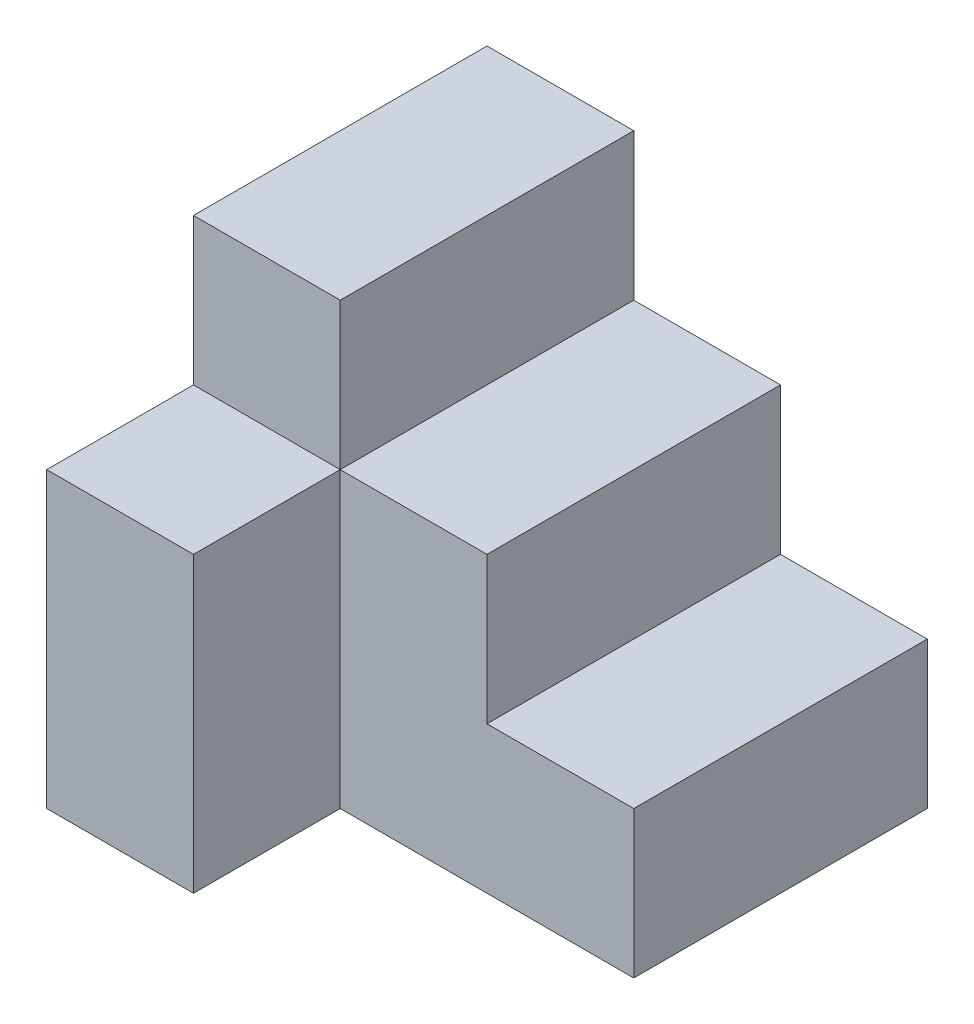
ISO-10303-21;
HEADER;
FILE_DESCRIPTION(('STEP AP214'),'2;1');
FILE_NAME('part.step','',(''),(''),'','','');
FILE_SCHEMA(('AUTOMOTIVE_DESIGN { 1 0 10303 214 1 1 1 1 }'));
ENDSEC;
DATA;
#1=APPLICATION_CONTEXT('core data for automotive mechanical design processes');
#2=APPLICATION_PROTOCOL_DEFINITION('international standard','automotive_design',2000,#1);
#3=PRODUCT_CONTEXT('',#1,'mechanical');
#4=PRODUCT('Part','Part','',(#3));
#5=PRODUCT_RELATED_PRODUCT_CATEGORY('part','',(#4));
#6=PRODUCT_DEFINITION_FORMATION('','',#4);
#7=PRODUCT_DEFINITION_CONTEXT('part definition',#1,'design');
#8=PRODUCT_DEFINITION('design','',#6,#7);
#9=PRODUCT_DEFINITION_SHAPE('','',#8);
#10=(LENGTH_UNIT() NAMED_UNIT(*) SI_UNIT(.MILLI.,.METRE.));
#11=(NAMED_UNIT(*) PLANE_ANGLE_UNIT() SI_UNIT($,.RADIAN.));
#12=(NAMED_UNIT(*) SI_UNIT($,.STERADIAN.) SOLID_ANGLE_UNIT());
#13=UNCERTAINTY_MEASURE_WITH_UNIT(LENGTH_MEASURE(1.E-05),#10,'distance_accuracy_value','');
#14=(GEOMETRIC_REPRESENTATION_CONTEXT(3) GLOBAL_UNCERTAINTY_ASSIGNED_CONTEXT((#13)) GLOBAL_UNIT_ASSIGNED_CONTEXT((#10,
#11,#12)) REPRESENTATION_CONTEXT('',''));
#15=CARTESIAN_POINT('',(0.,0.,0.));
#16=DIRECTION('',(0.,0.,1.));
#17=DIRECTION('',(1.,0.,0.));
#18=AXIS2_PLACEMENT_3D('',#15,#16,#17);
#19=CARTESIAN_POINT('',(0.,0.,-30.));
#20=DIRECTION('',(-1.,0.,0.));
#21=DIRECTION('',(0.,0.,1.));
#22=AXIS2_PLACEMENT_3D('',#19,#20,#21);
#23=PLANE('',#22);
#24=DIRECTION('',(0.,-1.,0.));
#25=VECTOR('',#24,1.);
#26=CARTESIAN_POINT('',(0.,0.,0.));
#27=LINE('',#26,#25);
#28=CARTESIAN_POINT('',(0.,20.,0.));
#29=VERTEX_POINT('',#28);
#30=CARTESIAN_POINT('',(0.,0.,0.));
#31=VERTEX_POINT('',#30);
#32=EDGE_CURVE('E69',#29,#31,#27,.T.);
#33=ORIENTED_EDGE('',*,*,#32,.F.);
#34=DIRECTION('',(0.,0.,1.));
#35=VECTOR('',#34,1.);
#36=CARTESIAN_POINT('',(0.,20.,0.));
#37=LINE('',#36,#35);
#38=CARTESIAN_POINT('',(0.,20.,-10.));
#39=VERTEX_POINT('',#38);
#40=EDGE_CURVE('E133',#39,#29,#37,.T.);
#41=ORIENTED_EDGE('',*,*,#40,.F.);
#42=DIRECTION('',(0.,-1.,0.));
#43=VECTOR('',#42,1.);
#44=CARTESIAN_POINT('',(0.,0.,-10.));
#45=LINE('',#44,#43);
#46=CARTESIAN_POINT('',(0.,30.,-10.));
#47=VERTEX_POINT('',#46);
#48=EDGE_CURVE('E124',#47,#39,#45,.T.);
#49=ORIENTED_EDGE('',*,*,#48,.F.);
#50=DIRECTION('',(0.,0.,1.));
#51=VECTOR('',#50,1.);
#52=CARTESIAN_POINT('',(0.,30.,-30.));
#53=LINE('',#52,#51);
#54=CARTESIAN_POINT('',(0.,30.,-30.));
#55=VERTEX_POINT('',#54);
#56=EDGE_CURVE('E203',#55,#47,#53,.T.);
#57=ORIENTED_EDGE('',*,*,#56,.F.);
#58=DIRECTION('',(0.,-1.,0.));
#59=VECTOR('',#58,1.);
#60=CARTESIAN_POINT('',(0.,0.,-30.));
#61=LINE('',#60,#59);
#62=CARTESIAN_POINT('',(0.,0.,-30.));
#63=VERTEX_POINT('',#62);
#64=EDGE_CURVE('E189',#55,#63,#61,.T.);
#65=ORIENTED_EDGE('',*,*,#64,.T.);
#66=DIRECTION('',(0.,0.,1.));
#67=VECTOR('',#66,1.);
#68=CARTESIAN_POINT('',(0.,0.,-30.));
#69=LINE('',#68,#67);
#70=EDGE_CURVE('E200',#63,#31,#69,.T.);
#71=ORIENTED_EDGE('',*,*,#70,.T.);
#72=EDGE_LOOP('',(#33,#41,#49,#57,#65,#71));
#73=FACE_BOUND('',#72,.T.);
#74=ADVANCED_FACE('F33',(#73),#23,.T.);
#75=CARTESIAN_POINT('',(0.,30.,-30.));
#76=DIRECTION('',(0.,1.,0.));
#77=DIRECTION('',(0.,0.,1.));
#78=AXIS2_PLACEMENT_3D('',#75,#76,#77);
#79=PLANE('',#78);
#80=ORIENTED_EDGE('',*,*,#56,.T.);
#81=DIRECTION('',(1.,0.,0.));
#82=VECTOR('',#81,1.);
#83=CARTESIAN_POINT('',(0.,30.,-10.));
#84=LINE('',#83,#82);
#85=CARTESIAN_POINT('',(10.,30.,-10.));
#86=VERTEX_POINT('',#85);
#87=EDGE_CURVE('E130',#47,#86,#84,.T.);
#88=ORIENTED_EDGE('',*,*,#87,.T.);
#89=DIRECTION('',(0.,0.,1.));
#90=VECTOR('',#89,1.);
#91=CARTESIAN_POINT('',(10.,30.,-30.));
#92=LINE('',#91,#90);
#93=CARTESIAN_POINT('',(10.,30.,-30.));
#94=VERTEX_POINT('',#93);
#95=EDGE_CURVE('E181',#94,#86,#92,.T.);
#96=ORIENTED_EDGE('',*,*,#95,.F.);
#97=DIRECTION('',(-1.,0.,0.));
#98=VECTOR('',#97,1.);
#99=CARTESIAN_POINT('',(0.,30.,-30.));
#100=LINE('',#99,#98);
#101=EDGE_CURVE('E56',#94,#55,#100,.T.);
#102=ORIENTED_EDGE('',*,*,#101,.T.);
#103=EDGE_LOOP('',(#80,#88,#96,#102));
#104=FACE_BOUND('',#103,.T.);
#105=ADVANCED_FACE('F223',(#104),#79,.T.);
#106=CARTESIAN_POINT('',(0.,0.,0.));
#107=DIRECTION('',(0.,0.,-1.));
#108=DIRECTION('',(-1.,0.,0.));
#109=AXIS2_PLACEMENT_3D('',#106,#107,#108);
#110=PLANE('',#109);
#111=DIRECTION('',(1.,0.,0.));
#112=VECTOR('',#111,1.);
#113=CARTESIAN_POINT('',(0.,20.,0.));
#114=LINE('',#113,#112);
#115=CARTESIAN_POINT('',(10.,20.,0.));
#116=VERTEX_POINT('',#115);
#117=EDGE_CURVE('E143',#29,#116,#114,.T.);
#118=ORIENTED_EDGE('',*,*,#117,.F.);
#119=ORIENTED_EDGE('',*,*,#32,.T.);
#120=DIRECTION('',(1.,0.,0.));
#121=VECTOR('',#120,1.);
#122=CARTESIAN_POINT('',(0.,0.,0.));
#123=LINE('',#122,#121);
#124=CARTESIAN_POINT('',(10.,0.,0.));
#125=VERTEX_POINT('',#124);
#126=EDGE_CURVE('E193',#31,#125,#123,.T.);
#127=ORIENTED_EDGE('',*,*,#126,.T.);
#128=DIRECTION('',(0.,-1.,0.));
#129=VECTOR('',#128,1.);
#130=CARTESIAN_POINT('',(10.,0.,0.));
#131=LINE('',#130,#129);
#132=EDGE_CURVE('E162',#116,#125,#131,.T.);
#133=ORIENTED_EDGE('',*,*,#132,.F.);
#134=EDGE_LOOP('',(#118,#119,#127,#133));
#135=FACE_BOUND('',#134,.T.);
#136=ADVANCED_FACE('F225',(#135),#110,.F.);
#137=CARTESIAN_POINT('',(10.,0.,-30.));
#138=DIRECTION('',(-1.,0.,0.));
#139=DIRECTION('',(0.,-1.,0.));
#140=AXIS2_PLACEMENT_3D('',#137,#138,#139);
#141=PLANE('',#140);
#142=DIRECTION('',(0.,0.,-1.));
#143=VECTOR('',#142,1.);
#144=CARTESIAN_POINT('',(10.,20.,-30.));
#145=LINE('',#144,#143);
#146=CARTESIAN_POINT('',(10.,20.,-10.));
#147=VERTEX_POINT('',#146);
#148=EDGE_CURVE('E138',#116,#147,#145,.T.);
#149=ORIENTED_EDGE('',*,*,#148,.F.);
#150=ORIENTED_EDGE('',*,*,#132,.T.);
#151=DIRECTION('',(0.,0.,1.));
#152=VECTOR('',#151,1.);
#153=CARTESIAN_POINT('',(10.,0.,0.));
#154=LINE('',#153,#152);
#155=CARTESIAN_POINT('',(10.,0.,-10.));
#156=VERTEX_POINT('',#155);
#157=EDGE_CURVE('E147',#156,#125,#154,.T.);
#158=ORIENTED_EDGE('',*,*,#157,.F.);
#159=DIRECTION('',(0.,1.,0.));
#160=VECTOR('',#159,1.);
#161=CARTESIAN_POINT('',(10.,0.,-10.));
#162=LINE('',#161,#160);
#163=EDGE_CURVE('E153',#156,#147,#162,.T.);
#164=ORIENTED_EDGE('',*,*,#163,.T.);
#165=EDGE_LOOP('',(#149,#150,#158,#164));
#166=FACE_BOUND('',#165,.T.);
#167=ADVANCED_FACE('F231',(#166),#141,.F.);
#168=DIRECTION('',(0.,1.,0.));
#169=VECTOR('',#168,1.);
#170=CARTESIAN_POINT('',(10.,0.,-10.));
#171=LINE('',#170,#169);
#172=EDGE_CURVE('E11',#147,#86,#171,.T.);
#173=ORIENTED_EDGE('',*,*,#172,.F.);
#174=DIRECTION('',(0.,0.,1.));
#175=VECTOR('',#174,1.);
#176=CARTESIAN_POINT('',(10.,20.,-30.));
#177=LINE('',#176,#175);
#178=CARTESIAN_POINT('',(10.,20.,-30.));
#179=VERTEX_POINT('',#178);
#180=EDGE_CURVE('E178',#179,#147,#177,.T.);
#181=ORIENTED_EDGE('',*,*,#180,.F.);
#182=DIRECTION('',(0.,-1.,0.));
#183=VECTOR('',#182,1.);
#184=CARTESIAN_POINT('',(10.,0.,-30.));
#185=LINE('',#184,#183);
#186=EDGE_CURVE('E169',#94,#179,#185,.T.);
#187=ORIENTED_EDGE('',*,*,#186,.F.);
#188=ORIENTED_EDGE('',*,*,#95,.T.);
#189=EDGE_LOOP('',(#173,#181,#187,#188));
#190=FACE_BOUND('',#189,.T.);
#191=ADVANCED_FACE('F222',(#190),#141,.F.);
#192=CARTESIAN_POINT('',(30.,0.,-30.));
#193=DIRECTION('',(1.,0.,0.));
#194=DIRECTION('',(0.,0.,-1.));
#195=AXIS2_PLACEMENT_3D('',#192,#193,#194);
#196=PLANE('',#195);
#197=DIRECTION('',(0.,1.,0.));
#198=VECTOR('',#197,1.);
#199=CARTESIAN_POINT('',(30.,0.,-10.));
#200=LINE('',#199,#198);
#201=CARTESIAN_POINT('',(30.,0.,-10.));
#202=VERTEX_POINT('',#201);
#203=CARTESIAN_POINT('',(30.,10.,-10.));
#204=VERTEX_POINT('',#203);
#205=EDGE_CURVE('E47',#202,#204,#200,.T.);
#206=ORIENTED_EDGE('',*,*,#205,.F.);
#207=DIRECTION('',(0.,0.,1.));
#208=VECTOR('',#207,1.);
#209=CARTESIAN_POINT('',(30.,0.,-30.));
#210=LINE('',#209,#208);
#211=CARTESIAN_POINT('',(30.,0.,-30.));
#212=VERTEX_POINT('',#211);
#213=EDGE_CURVE('E205',#212,#202,#210,.T.);
#214=ORIENTED_EDGE('',*,*,#213,.F.);
#215=DIRECTION('',(0.,1.,0.));
#216=VECTOR('',#215,1.);
#217=CARTESIAN_POINT('',(30.,0.,-30.));
#218=LINE('',#217,#216);
#219=CARTESIAN_POINT('',(30.,10.,-30.));
#220=VERTEX_POINT('',#219);
#221=EDGE_CURVE('E196',#212,#220,#218,.T.);
#222=ORIENTED_EDGE('',*,*,#221,.T.);
#223=DIRECTION('',(0.,0.,1.));
#224=VECTOR('',#223,1.);
#225=CARTESIAN_POINT('',(30.,10.,-30.));
#226=LINE('',#225,#224);
#227=EDGE_CURVE('E184',#220,#204,#226,.T.);
#228=ORIENTED_EDGE('',*,*,#227,.T.);
#229=EDGE_LOOP('',(#206,#214,#222,#228));
#230=FACE_BOUND('',#229,.T.);
#231=ADVANCED_FACE('F212',(#230),#196,.T.);
#232=CARTESIAN_POINT('',(0.,0.,-30.));
#233=DIRECTION('',(0.,-1.,0.));
#234=DIRECTION('',(0.,0.,-1.));
#235=AXIS2_PLACEMENT_3D('',#232,#233,#234);
#236=PLANE('',#235);
#237=ORIENTED_EDGE('',*,*,#157,.T.);
#238=ORIENTED_EDGE('',*,*,#126,.F.);
#239=ORIENTED_EDGE('',*,*,#70,.F.);
#240=DIRECTION('',(1.,0.,0.));
#241=VECTOR('',#240,1.);
#242=CARTESIAN_POINT('',(0.,0.,-30.));
#243=LINE('',#242,#241);
#244=EDGE_CURVE('E192',#63,#212,#243,.T.);
#245=ORIENTED_EDGE('',*,*,#244,.T.);
#246=ORIENTED_EDGE('',*,*,#213,.T.);
#247=DIRECTION('',(-1.,0.,0.));
#248=VECTOR('',#247,1.);
#249=CARTESIAN_POINT('',(10.,0.,-10.));
#250=LINE('',#249,#248);
#251=EDGE_CURVE('E150',#202,#156,#250,.T.);
#252=ORIENTED_EDGE('',*,*,#251,.T.);
#253=EDGE_LOOP('',(#237,#238,#239,#245,#246,#252));
#254=FACE_BOUND('',#253,.T.);
#255=ADVANCED_FACE('F219',(#254),#236,.T.);
#256=CARTESIAN_POINT('',(0.,0.,-30.));
#257=DIRECTION('',(0.,0.,-1.));
#258=DIRECTION('',(-1.,0.,0.));
#259=AXIS2_PLACEMENT_3D('',#256,#257,#258);
#260=PLANE('',#259);
#261=ORIENTED_EDGE('',*,*,#186,.T.);
#262=DIRECTION('',(1.,0.,0.));
#263=VECTOR('',#262,1.);
#264=CARTESIAN_POINT('',(0.,20.,-30.));
#265=LINE('',#264,#263);
#266=CARTESIAN_POINT('',(20.,20.,-30.));
#267=VERTEX_POINT('',#266);
#268=EDGE_CURVE('E172',#179,#267,#265,.T.);
#269=ORIENTED_EDGE('',*,*,#268,.T.);
#270=DIRECTION('',(0.,-1.,0.));
#271=VECTOR('',#270,1.);
#272=CARTESIAN_POINT('',(20.,0.,-30.));
#273=LINE('',#272,#271);
#274=CARTESIAN_POINT('',(20.,10.,-30.));
#275=VERTEX_POINT('',#274);
#276=EDGE_CURVE('E163',#267,#275,#273,.T.);
#277=ORIENTED_EDGE('',*,*,#276,.T.);
#278=DIRECTION('',(1.,0.,0.));
#279=VECTOR('',#278,1.);
#280=CARTESIAN_POINT('',(0.,10.,-30.));
#281=LINE('',#280,#279);
#282=EDGE_CURVE('E166',#275,#220,#281,.T.);
#283=ORIENTED_EDGE('',*,*,#282,.T.);
#284=ORIENTED_EDGE('',*,*,#221,.F.);
#285=ORIENTED_EDGE('',*,*,#244,.F.);
#286=ORIENTED_EDGE('',*,*,#64,.F.);
#287=ORIENTED_EDGE('',*,*,#101,.F.);
#288=EDGE_LOOP('',(#261,#269,#277,#283,#284,#285,#286,#287));
#289=FACE_BOUND('',#288,.T.);
#290=ADVANCED_FACE('F216',(#289),#260,.T.);
#291=CARTESIAN_POINT('',(20.,0.,-30.));
#292=DIRECTION('',(-1.,0.,0.));
#293=DIRECTION('',(0.,0.,1.));
#294=AXIS2_PLACEMENT_3D('',#291,#292,#293);
#295=PLANE('',#294);
#296=DIRECTION('',(0.,0.,1.));
#297=VECTOR('',#296,1.);
#298=CARTESIAN_POINT('',(20.,20.,-30.));
#299=LINE('',#298,#297);
#300=CARTESIAN_POINT('',(20.,20.,-10.));
#301=VERTEX_POINT('',#300);
#302=EDGE_CURVE('E79',#267,#301,#299,.T.);
#303=ORIENTED_EDGE('',*,*,#302,.T.);
#304=DIRECTION('',(0.,-1.,0.));
#305=VECTOR('',#304,1.);
#306=CARTESIAN_POINT('',(20.,0.,-10.));
#307=LINE('',#306,#305);
#308=CARTESIAN_POINT('',(20.,10.,-10.));
#309=VERTEX_POINT('',#308);
#310=EDGE_CURVE('E156',#301,#309,#307,.T.);
#311=ORIENTED_EDGE('',*,*,#310,.T.);
#312=DIRECTION('',(0.,0.,1.));
#313=VECTOR('',#312,1.);
#314=CARTESIAN_POINT('',(20.,10.,-30.));
#315=LINE('',#314,#313);
#316=EDGE_CURVE('E175',#275,#309,#315,.T.);
#317=ORIENTED_EDGE('',*,*,#316,.F.);
#318=ORIENTED_EDGE('',*,*,#276,.F.);
#319=EDGE_LOOP('',(#303,#311,#317,#318));
#320=FACE_BOUND('',#319,.T.);
#321=ADVANCED_FACE('F240',(#320),#295,.F.);
#322=CARTESIAN_POINT('',(0.,20.,-30.));
#323=DIRECTION('',(0.,-1.,0.));
#324=DIRECTION('',(0.,0.,-1.));
#325=AXIS2_PLACEMENT_3D('',#322,#323,#324);
#326=PLANE('',#325);
#327=ORIENTED_EDGE('',*,*,#180,.T.);
#328=DIRECTION('',(1.,0.,0.));
#329=VECTOR('',#328,1.);
#330=CARTESIAN_POINT('',(0.,20.,-10.));
#331=LINE('',#330,#329);
#332=EDGE_CURVE('E160',#147,#301,#331,.T.);
#333=ORIENTED_EDGE('',*,*,#332,.T.);
#334=ORIENTED_EDGE('',*,*,#302,.F.);
#335=ORIENTED_EDGE('',*,*,#268,.F.);
#336=EDGE_LOOP('',(#327,#333,#334,#335));
#337=FACE_BOUND('',#336,.T.);
#338=ADVANCED_FACE('F244',(#337),#326,.F.);
#339=CARTESIAN_POINT('',(0.,10.,-30.));
#340=DIRECTION('',(0.,-1.,0.));
#341=DIRECTION('',(1.,0.,0.));
#342=AXIS2_PLACEMENT_3D('',#339,#340,#341);
#343=PLANE('',#342);
#344=ORIENTED_EDGE('',*,*,#316,.T.);
#345=DIRECTION('',(1.,0.,0.));
#346=VECTOR('',#345,1.);
#347=CARTESIAN_POINT('',(0.,10.,-10.));
#348=LINE('',#347,#346);
#349=EDGE_CURVE('E40',#309,#204,#348,.T.);
#350=ORIENTED_EDGE('',*,*,#349,.T.);
#351=ORIENTED_EDGE('',*,*,#227,.F.);
#352=ORIENTED_EDGE('',*,*,#282,.F.);
#353=EDGE_LOOP('',(#344,#350,#351,#352));
#354=FACE_BOUND('',#353,.T.);
#355=ADVANCED_FACE('F209',(#354),#343,.F.);
#356=CARTESIAN_POINT('',(10.,0.,-10.));
#357=DIRECTION('',(0.,0.,-1.));
#358=DIRECTION('',(-1.,0.,0.));
#359=AXIS2_PLACEMENT_3D('',#356,#357,#358);
#360=PLANE('',#359);
#361=ORIENTED_EDGE('',*,*,#163,.F.);
#362=ORIENTED_EDGE('',*,*,#251,.F.);
#363=ORIENTED_EDGE('',*,*,#205,.T.);
#364=ORIENTED_EDGE('',*,*,#349,.F.);
#365=ORIENTED_EDGE('',*,*,#310,.F.);
#366=ORIENTED_EDGE('',*,*,#332,.F.);
#367=EDGE_LOOP('',(#361,#362,#363,#364,#365,#366));
#368=FACE_BOUND('',#367,.T.);
#369=ADVANCED_FACE('F250',(#368),#360,.F.);
#370=CARTESIAN_POINT('',(0.,0.,-10.));
#371=DIRECTION('',(0.,0.,1.));
#372=DIRECTION('',(1.,0.,0.));
#373=AXIS2_PLACEMENT_3D('',#370,#371,#372);
#374=PLANE('',#373);
#375=ORIENTED_EDGE('',*,*,#172,.T.);
#376=ORIENTED_EDGE('',*,*,#87,.F.);
#377=ORIENTED_EDGE('',*,*,#48,.T.);
#378=DIRECTION('',(1.,0.,0.));
#379=VECTOR('',#378,1.);
#380=CARTESIAN_POINT('',(0.,20.,-10.));
#381=LINE('',#380,#379);
#382=EDGE_CURVE('E127',#39,#147,#381,.T.);
#383=ORIENTED_EDGE('',*,*,#382,.T.);
#384=EDGE_LOOP('',(#375,#376,#377,#383));
#385=FACE_BOUND('',#384,.T.);
#386=ADVANCED_FACE('F126',(#385),#374,.T.);
#387=CARTESIAN_POINT('',(0.,20.,0.));
#388=DIRECTION('',(0.,1.,0.));
#389=DIRECTION('',(0.,0.,1.));
#390=AXIS2_PLACEMENT_3D('',#387,#388,#389);
#391=PLANE('',#390);
#392=ORIENTED_EDGE('',*,*,#148,.T.);
#393=ORIENTED_EDGE('',*,*,#382,.F.);
#394=ORIENTED_EDGE('',*,*,#40,.T.);
#395=ORIENTED_EDGE('',*,*,#117,.T.);
#396=EDGE_LOOP('',(#392,#393,#394,#395));
#397=FACE_BOUND('',#396,.T.);
#398=ADVANCED_FACE('F136',(#397),#391,.T.);
#399=CLOSED_SHELL('',(#74,#105,#136,#167,#191,#231,#255,#290,#321,#338,#355,#369,#386,#398));
#400=MANIFOLD_SOLID_BREP('B2',#399);
#401=ADVANCED_BREP_SHAPE_REPRESENTATION('',(#18,#400),#14);
#402=SHAPE_DEFINITION_REPRESENTATION(#9,#401);
ENDSEC;
END-ISO-10303-21;
